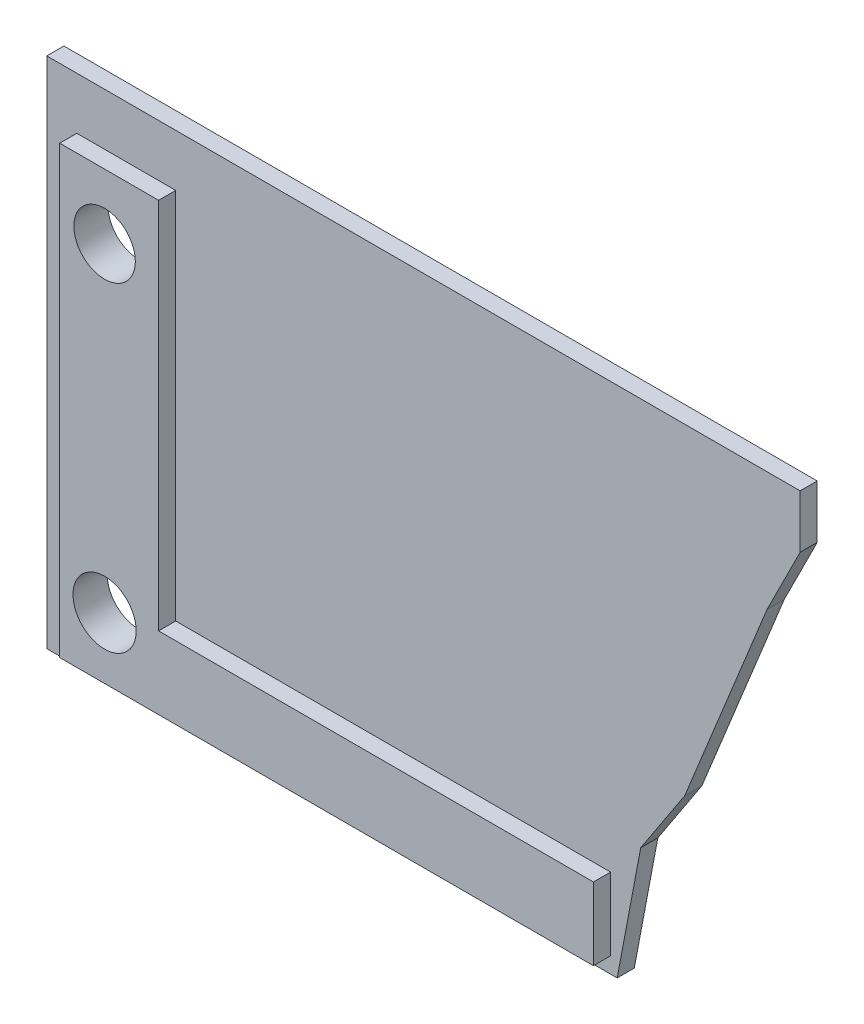
ISO-10303-21;
HEADER;
FILE_DESCRIPTION(('STEP AP214'),'2;1');
FILE_NAME('part.step','',(''),(''),'','','');
FILE_SCHEMA(('AUTOMOTIVE_DESIGN { 1 0 10303 214 1 1 1 1 }'));
ENDSEC;
DATA;
#1=APPLICATION_CONTEXT('core data for automotive mechanical design processes');
#2=APPLICATION_PROTOCOL_DEFINITION('international standard','automotive_design',2000,#1);
#3=PRODUCT_CONTEXT('',#1,'mechanical');
#4=PRODUCT('Part','Part','',(#3));
#5=PRODUCT_RELATED_PRODUCT_CATEGORY('part','',(#4));
#6=PRODUCT_DEFINITION_FORMATION('','',#4);
#7=PRODUCT_DEFINITION_CONTEXT('part definition',#1,'design');
#8=PRODUCT_DEFINITION('design','',#6,#7);
#9=PRODUCT_DEFINITION_SHAPE('','',#8);
#10=(LENGTH_UNIT() NAMED_UNIT(*) SI_UNIT(.MILLI.,.METRE.));
#11=(NAMED_UNIT(*) PLANE_ANGLE_UNIT() SI_UNIT($,.RADIAN.));
#12=(NAMED_UNIT(*) SI_UNIT($,.STERADIAN.) SOLID_ANGLE_UNIT());
#13=UNCERTAINTY_MEASURE_WITH_UNIT(LENGTH_MEASURE(1.E-05),#10,'distance_accuracy_value','');
#14=(GEOMETRIC_REPRESENTATION_CONTEXT(3) GLOBAL_UNCERTAINTY_ASSIGNED_CONTEXT((#13)) GLOBAL_UNIT_ASSIGNED_CONTEXT((#10,
#11,#12)) REPRESENTATION_CONTEXT('',''));
#15=CARTESIAN_POINT('',(0.,0.,0.));
#16=DIRECTION('',(0.,0.,1.));
#17=DIRECTION('',(1.,0.,0.));
#18=AXIS2_PLACEMENT_3D('',#15,#16,#17);
#19=CARTESIAN_POINT('',(0.,0.,6.));
#20=DIRECTION('',(0.,0.,1.));
#21=DIRECTION('',(1.,0.,0.));
#22=AXIS2_PLACEMENT_3D('',#19,#20,#21);
#23=PLANE('',#22);
#24=DIRECTION('',(0.376636486318889,0.92636113755563,0.));
#25=VECTOR('',#24,1.);
#26=CARTESIAN_POINT('',(137.969021905152,-56.0949348202656,6.));
#27=LINE('',#26,#25);
#28=CARTESIAN_POINT('',(168.005565446351,17.7818340371897,6.));
#29=VERTEX_POINT('',#28);
#30=CARTESIAN_POINT('',(196.86553904165,88.7647550782788,6.));
#31=VERTEX_POINT('',#30);
#32=EDGE_CURVE('E194',#29,#31,#27,.T.);
#33=ORIENTED_EDGE('',*,*,#32,.T.);
#34=DIRECTION('',(0.447619623580755,0.894224061734767,0.));
#35=VECTOR('',#34,1.);
#36=CARTESIAN_POINT('',(121.890837423235,-61.0146081950482,6.));
#37=LINE('',#36,#35);
#38=CARTESIAN_POINT('',(208.451032663444,111.909466833332,6.));
#39=VERTEX_POINT('',#38);
#40=EDGE_CURVE('E197',#31,#39,#37,.T.);
#41=ORIENTED_EDGE('',*,*,#40,.T.);
#42=DIRECTION('',(0.,-1.,0.));
#43=VECTOR('',#42,1.);
#44=CARTESIAN_POINT('',(208.451032663444,0.,6.));
#45=LINE('',#44,#43);
#46=CARTESIAN_POINT('',(208.451032663444,130.57113323124,6.));
#47=VERTEX_POINT('',#46);
#48=EDGE_CURVE('E200',#47,#39,#45,.T.);
#49=ORIENTED_EDGE('',*,*,#48,.F.);
#50=DIRECTION('',(1.,0.,0.));
#51=VECTOR('',#50,1.);
#52=CARTESIAN_POINT('',(0.,130.57113323124,6.));
#53=LINE('',#52,#51);
#54=CARTESIAN_POINT('',(-55.6864145286311,130.57113323124,6.));
#55=VERTEX_POINT('',#54);
#56=EDGE_CURVE('E203',#55,#47,#53,.T.);
#57=ORIENTED_EDGE('',*,*,#56,.F.);
#58=DIRECTION('',(0.,-1.,0.));
#59=VECTOR('',#58,1.);
#60=CARTESIAN_POINT('',(-55.6864145286311,0.,6.));
#61=LINE('',#60,#59);
#62=CARTESIAN_POINT('',(-55.6864145286311,-49.4288667687596,6.));
#63=VERTEX_POINT('',#62);
#64=EDGE_CURVE('E206',#55,#63,#61,.T.);
#65=ORIENTED_EDGE('',*,*,#64,.T.);
#66=DIRECTION('',(1.,0.,0.));
#67=VECTOR('',#66,1.);
#68=CARTESIAN_POINT('',(0.,-49.4288667687596,6.));
#69=LINE('',#68,#67);
#70=CARTESIAN_POINT('',(144.313585471369,-49.4288667687596,6.));
#71=VERTEX_POINT('',#70);
#72=EDGE_CURVE('E208',#63,#71,#69,.T.);
#73=ORIENTED_EDGE('',*,*,#72,.T.);
#74=DIRECTION('',(0.185579114608786,0.98262932595207,0.));
#75=VECTOR('',#74,1.);
#76=CARTESIAN_POINT('',(148.3571069308,-28.0186839767509,6.));
#77=LINE('',#76,#75);
#78=CARTESIAN_POINT('',(152.562750690734,-5.75007416184603,6.));
#79=VERTEX_POINT('',#78);
#80=EDGE_CURVE('E210',#71,#79,#77,.T.);
#81=ORIENTED_EDGE('',*,*,#80,.T.);
#82=DIRECTION('',(0.548656441486821,0.836047910837063,0.));
#83=VECTOR('',#82,1.);
#84=CARTESIAN_POINT('',(109.275294569333,-71.7119120611243,6.));
#85=LINE('',#84,#83);
#86=EDGE_CURVE('E212',#79,#29,#85,.T.);
#87=ORIENTED_EDGE('',*,*,#86,.T.);
#88=EDGE_LOOP('',(#33,#41,#49,#57,#65,#73,#81,#87));
#89=FACE_BOUND('',#88,.T.);
#90=DIRECTION('',(0.,1.,0.));
#91=VECTOR('',#90,1.);
#92=CARTESIAN_POINT('',(141.983334497754,-18.4296154829896,6.));
#93=LINE('',#92,#91);
#94=CARTESIAN_POINT('',(141.983334497754,-43.865522875729,6.));
#95=VERTEX_POINT('',#94);
#96=CARTESIAN_POINT('',(141.983334497754,-18.4296154829896,6.));
#97=VERTEX_POINT('',#96);
#98=EDGE_CURVE('E164',#95,#97,#93,.T.);
#99=ORIENTED_EDGE('',*,*,#98,.F.);
#100=DIRECTION('',(1.,0.,0.));
#101=VECTOR('',#100,1.);
#102=CARTESIAN_POINT('',(-45.1468295236403,-43.865522875729,6.));
#103=LINE('',#102,#101);
#104=CARTESIAN_POINT('',(-45.1468295236403,-43.865522875729,6.));
#105=VERTEX_POINT('',#104);
#106=EDGE_CURVE('E50',#105,#95,#103,.T.);
#107=ORIENTED_EDGE('',*,*,#106,.F.);
#108=DIRECTION('',(0.,-1.,0.));
#109=VECTOR('',#108,1.);
#110=CARTESIAN_POINT('',(-45.1468295236403,112.332971202947,6.));
#111=LINE('',#110,#109);
#112=CARTESIAN_POINT('',(-45.1468295236403,112.332971202947,6.));
#113=VERTEX_POINT('',#112);
#114=EDGE_CURVE('E149',#113,#105,#111,.T.);
#115=ORIENTED_EDGE('',*,*,#114,.F.);
#116=DIRECTION('',(1.,0.,0.));
#117=VECTOR('',#116,1.);
#118=CARTESIAN_POINT('',(-45.1468295236403,112.332971202947,6.));
#119=LINE('',#118,#117);
#120=CARTESIAN_POINT('',(-10.4774740360104,112.332971202947,6.));
#121=VERTEX_POINT('',#120);
#122=EDGE_CURVE('E183',#113,#121,#119,.T.);
#123=ORIENTED_EDGE('',*,*,#122,.T.);
#124=DIRECTION('',(0.,-1.,0.));
#125=VECTOR('',#124,1.);
#126=CARTESIAN_POINT('',(-10.4774740360104,112.332971202947,6.));
#127=LINE('',#126,#125);
#128=CARTESIAN_POINT('',(-10.4774740360104,-18.4296154829896,6.));
#129=VERTEX_POINT('',#128);
#130=EDGE_CURVE('E181',#121,#129,#127,.T.);
#131=ORIENTED_EDGE('',*,*,#130,.T.);
#132=DIRECTION('',(-1.,0.,0.));
#133=VECTOR('',#132,1.);
#134=CARTESIAN_POINT('',(-10.4774740360104,-18.4296154829896,6.));
#135=LINE('',#134,#133);
#136=EDGE_CURVE('E57',#97,#129,#135,.T.);
#137=ORIENTED_EDGE('',*,*,#136,.F.);
#138=EDGE_LOOP('',(#99,#107,#115,#123,#131,#137));
#139=FACE_BOUND('',#138,.T.);
#140=ADVANCED_FACE('F35',(#89,#139),#23,.T.);
#141=CARTESIAN_POINT('',(-10.4774740360104,112.332971202947,12.));
#142=DIRECTION('',(1.,0.,0.));
#143=DIRECTION('',(0.,0.,-1.));
#144=AXIS2_PLACEMENT_3D('',#141,#142,#143);
#145=PLANE('',#144);
#146=DIRECTION('',(0.,-1.,0.));
#147=VECTOR('',#146,1.);
#148=CARTESIAN_POINT('',(-10.4774740360104,112.332971202947,12.));
#149=LINE('',#148,#147);
#150=CARTESIAN_POINT('',(-10.4774740360104,112.332971202947,12.));
#151=VERTEX_POINT('',#150);
#152=CARTESIAN_POINT('',(-10.4774740360104,-18.4296154829896,12.));
#153=VERTEX_POINT('',#152);
#154=EDGE_CURVE('E148',#151,#153,#149,.T.);
#155=ORIENTED_EDGE('',*,*,#154,.T.);
#156=DIRECTION('',(0.,0.,-1.));
#157=VECTOR('',#156,1.);
#158=CARTESIAN_POINT('',(-10.4774740360104,-18.4296154829896,12.));
#159=LINE('',#158,#157);
#160=EDGE_CURVE('E162',#153,#129,#159,.T.);
#161=ORIENTED_EDGE('',*,*,#160,.T.);
#162=ORIENTED_EDGE('',*,*,#130,.F.);
#163=DIRECTION('',(0.,0.,-1.));
#164=VECTOR('',#163,1.);
#165=CARTESIAN_POINT('',(-10.4774740360104,112.332971202947,12.));
#166=LINE('',#165,#164);
#167=EDGE_CURVE('E191',#151,#121,#166,.T.);
#168=ORIENTED_EDGE('',*,*,#167,.F.);
#169=EDGE_LOOP('',(#155,#161,#162,#168));
#170=FACE_BOUND('',#169,.T.);
#171=ADVANCED_FACE('F294',(#170),#145,.T.);
#172=CARTESIAN_POINT('',(137.969021905152,-56.0949348202656,6.));
#173=DIRECTION('',(-0.92636113755563,0.376636486318889,0.));
#174=DIRECTION('',(-0.376636486318889,-0.92636113755563,0.));
#175=AXIS2_PLACEMENT_3D('',#172,#173,#174);
#176=PLANE('',#175);
#177=DIRECTION('',(0.376636486318889,0.92636113755563,0.));
#178=VECTOR('',#177,1.);
#179=CARTESIAN_POINT('',(137.969021905152,-56.0949348202656,0.));
#180=LINE('',#179,#178);
#181=CARTESIAN_POINT('',(168.005565446351,17.7818340371897,0.));
#182=VERTEX_POINT('',#181);
#183=CARTESIAN_POINT('',(196.86553904165,88.7647550782788,0.));
#184=VERTEX_POINT('',#183);
#185=EDGE_CURVE('E193',#182,#184,#180,.T.);
#186=ORIENTED_EDGE('',*,*,#185,.T.);
#187=DIRECTION('',(0.,0.,-1.));
#188=VECTOR('',#187,1.);
#189=CARTESIAN_POINT('',(196.86553904165,88.7647550782788,6.));
#190=LINE('',#189,#188);
#191=EDGE_CURVE('E11',#31,#184,#190,.T.);
#192=ORIENTED_EDGE('',*,*,#191,.F.);
#193=ORIENTED_EDGE('',*,*,#32,.F.);
#194=DIRECTION('',(0.,0.,-1.));
#195=VECTOR('',#194,1.);
#196=CARTESIAN_POINT('',(168.005565446351,17.7818340371897,6.));
#197=LINE('',#196,#195);
#198=EDGE_CURVE('E214',#29,#182,#197,.T.);
#199=ORIENTED_EDGE('',*,*,#198,.T.);
#200=EDGE_LOOP('',(#186,#192,#193,#199));
#201=FACE_BOUND('',#200,.T.);
#202=ADVANCED_FACE('F37',(#201),#176,.F.);
#203=CARTESIAN_POINT('',(121.890837423235,-61.0146081950482,6.));
#204=DIRECTION('',(-0.894224061734766,0.447619623580755,0.));
#205=DIRECTION('',(-0.447619623580755,-0.894224061734766,0.));
#206=AXIS2_PLACEMENT_3D('',#203,#204,#205);
#207=PLANE('',#206);
#208=DIRECTION('',(0.447619623580755,0.894224061734767,0.));
#209=VECTOR('',#208,1.);
#210=CARTESIAN_POINT('',(121.890837423235,-61.0146081950482,0.));
#211=LINE('',#210,#209);
#212=CARTESIAN_POINT('',(208.451032663444,111.909466833332,0.));
#213=VERTEX_POINT('',#212);
#214=EDGE_CURVE('E217',#184,#213,#211,.T.);
#215=ORIENTED_EDGE('',*,*,#214,.T.);
#216=DIRECTION('',(0.,0.,-1.));
#217=VECTOR('',#216,1.);
#218=CARTESIAN_POINT('',(208.451032663444,111.909466833332,6.));
#219=LINE('',#218,#217);
#220=EDGE_CURVE('E43',#39,#213,#219,.T.);
#221=ORIENTED_EDGE('',*,*,#220,.F.);
#222=ORIENTED_EDGE('',*,*,#40,.F.);
#223=ORIENTED_EDGE('',*,*,#191,.T.);
#224=EDGE_LOOP('',(#215,#221,#222,#223));
#225=FACE_BOUND('',#224,.T.);
#226=ADVANCED_FACE('F253',(#225),#207,.F.);
#227=CARTESIAN_POINT('',(208.451032663444,0.,6.));
#228=DIRECTION('',(1.,0.,0.));
#229=DIRECTION('',(0.,0.,-1.));
#230=AXIS2_PLACEMENT_3D('',#227,#228,#229);
#231=PLANE('',#230);
#232=DIRECTION('',(0.,-1.,0.));
#233=VECTOR('',#232,1.);
#234=CARTESIAN_POINT('',(208.451032663444,0.,0.));
#235=LINE('',#234,#233);
#236=CARTESIAN_POINT('',(208.451032663444,130.57113323124,0.));
#237=VERTEX_POINT('',#236);
#238=EDGE_CURVE('E220',#237,#213,#235,.T.);
#239=ORIENTED_EDGE('',*,*,#238,.F.);
#240=DIRECTION('',(0.,0.,-1.));
#241=VECTOR('',#240,1.);
#242=CARTESIAN_POINT('',(208.451032663444,130.57113323124,6.));
#243=LINE('',#242,#241);
#244=EDGE_CURVE('E246',#47,#237,#243,.T.);
#245=ORIENTED_EDGE('',*,*,#244,.F.);
#246=ORIENTED_EDGE('',*,*,#48,.T.);
#247=ORIENTED_EDGE('',*,*,#220,.T.);
#248=EDGE_LOOP('',(#239,#245,#246,#247));
#249=FACE_BOUND('',#248,.T.);
#250=ADVANCED_FACE('F250',(#249),#231,.T.);
#251=CARTESIAN_POINT('',(0.,130.57113323124,6.));
#252=DIRECTION('',(0.,1.,0.));
#253=DIRECTION('',(0.,0.,1.));
#254=AXIS2_PLACEMENT_3D('',#251,#252,#253);
#255=PLANE('',#254);
#256=DIRECTION('',(1.,0.,0.));
#257=VECTOR('',#256,1.);
#258=CARTESIAN_POINT('',(0.,130.57113323124,0.));
#259=LINE('',#258,#257);
#260=CARTESIAN_POINT('',(-55.6864145286311,130.57113323124,0.));
#261=VERTEX_POINT('',#260);
#262=EDGE_CURVE('E223',#261,#237,#259,.T.);
#263=ORIENTED_EDGE('',*,*,#262,.F.);
#264=DIRECTION('',(0.,0.,-1.));
#265=VECTOR('',#264,1.);
#266=CARTESIAN_POINT('',(-55.6864145286311,130.57113323124,6.));
#267=LINE('',#266,#265);
#268=EDGE_CURVE('E244',#55,#261,#267,.T.);
#269=ORIENTED_EDGE('',*,*,#268,.F.);
#270=ORIENTED_EDGE('',*,*,#56,.T.);
#271=ORIENTED_EDGE('',*,*,#244,.T.);
#272=EDGE_LOOP('',(#263,#269,#270,#271));
#273=FACE_BOUND('',#272,.T.);
#274=ADVANCED_FACE('F262',(#273),#255,.T.);
#275=CARTESIAN_POINT('',(-55.6864145286311,0.,6.));
#276=DIRECTION('',(1.,0.,0.));
#277=DIRECTION('',(0.,1.,0.));
#278=AXIS2_PLACEMENT_3D('',#275,#276,#277);
#279=PLANE('',#278);
#280=DIRECTION('',(0.,-1.,0.));
#281=VECTOR('',#280,1.);
#282=CARTESIAN_POINT('',(-55.6864145286311,0.,0.));
#283=LINE('',#282,#281);
#284=CARTESIAN_POINT('',(-55.6864145286311,-49.4288667687596,0.));
#285=VERTEX_POINT('',#284);
#286=EDGE_CURVE('E226',#261,#285,#283,.T.);
#287=ORIENTED_EDGE('',*,*,#286,.T.);
#288=DIRECTION('',(0.,0.,-1.));
#289=VECTOR('',#288,1.);
#290=CARTESIAN_POINT('',(-55.6864145286311,-49.4288667687596,6.));
#291=LINE('',#290,#289);
#292=EDGE_CURVE('E241',#63,#285,#291,.T.);
#293=ORIENTED_EDGE('',*,*,#292,.F.);
#294=ORIENTED_EDGE('',*,*,#64,.F.);
#295=ORIENTED_EDGE('',*,*,#268,.T.);
#296=EDGE_LOOP('',(#287,#293,#294,#295));
#297=FACE_BOUND('',#296,.T.);
#298=ADVANCED_FACE('F284',(#297),#279,.F.);
#299=CARTESIAN_POINT('',(0.,-49.4288667687596,6.));
#300=DIRECTION('',(0.,1.,0.));
#301=DIRECTION('',(0.,0.,1.));
#302=AXIS2_PLACEMENT_3D('',#299,#300,#301);
#303=PLANE('',#302);
#304=DIRECTION('',(1.,0.,0.));
#305=VECTOR('',#304,1.);
#306=CARTESIAN_POINT('',(0.,-49.4288667687596,0.));
#307=LINE('',#306,#305);
#308=CARTESIAN_POINT('',(144.313585471369,-49.4288667687596,0.));
#309=VERTEX_POINT('',#308);
#310=EDGE_CURVE('E228',#285,#309,#307,.T.);
#311=ORIENTED_EDGE('',*,*,#310,.T.);
#312=DIRECTION('',(0.,0.,-1.));
#313=VECTOR('',#312,1.);
#314=CARTESIAN_POINT('',(144.313585471369,-49.4288667687596,6.));
#315=LINE('',#314,#313);
#316=EDGE_CURVE('E238',#71,#309,#315,.T.);
#317=ORIENTED_EDGE('',*,*,#316,.F.);
#318=ORIENTED_EDGE('',*,*,#72,.F.);
#319=ORIENTED_EDGE('',*,*,#292,.T.);
#320=EDGE_LOOP('',(#311,#317,#318,#319));
#321=FACE_BOUND('',#320,.T.);
#322=ADVANCED_FACE('F281',(#321),#303,.F.);
#323=CARTESIAN_POINT('',(148.3571069308,-28.0186839767509,6.));
#324=DIRECTION('',(-0.98262932595207,0.185579114608786,0.));
#325=DIRECTION('',(-0.185579114608786,-0.98262932595207,0.));
#326=AXIS2_PLACEMENT_3D('',#323,#324,#325);
#327=PLANE('',#326);
#328=DIRECTION('',(0.185579114608786,0.98262932595207,0.));
#329=VECTOR('',#328,1.);
#330=CARTESIAN_POINT('',(148.3571069308,-28.0186839767509,0.));
#331=LINE('',#330,#329);
#332=CARTESIAN_POINT('',(152.562750690734,-5.75007416184603,0.));
#333=VERTEX_POINT('',#332);
#334=EDGE_CURVE('E230',#309,#333,#331,.T.);
#335=ORIENTED_EDGE('',*,*,#334,.T.);
#336=DIRECTION('',(0.,0.,-1.));
#337=VECTOR('',#336,1.);
#338=CARTESIAN_POINT('',(152.562750690734,-5.75007416184603,6.));
#339=LINE('',#338,#337);
#340=EDGE_CURVE('E235',#79,#333,#339,.T.);
#341=ORIENTED_EDGE('',*,*,#340,.F.);
#342=ORIENTED_EDGE('',*,*,#80,.F.);
#343=ORIENTED_EDGE('',*,*,#316,.T.);
#344=EDGE_LOOP('',(#335,#341,#342,#343));
#345=FACE_BOUND('',#344,.T.);
#346=ADVANCED_FACE('F277',(#345),#327,.F.);
#347=CARTESIAN_POINT('',(109.275294569333,-71.7119120611243,6.));
#348=DIRECTION('',(-0.836047910837063,0.548656441486821,0.));
#349=DIRECTION('',(-0.548656441486821,-0.836047910837063,0.));
#350=AXIS2_PLACEMENT_3D('',#347,#348,#349);
#351=PLANE('',#350);
#352=DIRECTION('',(0.548656441486821,0.836047910837063,0.));
#353=VECTOR('',#352,1.);
#354=CARTESIAN_POINT('',(109.275294569333,-71.7119120611243,0.));
#355=LINE('',#354,#353);
#356=EDGE_CURVE('E198',#333,#182,#355,.T.);
#357=ORIENTED_EDGE('',*,*,#356,.T.);
#358=ORIENTED_EDGE('',*,*,#198,.F.);
#359=ORIENTED_EDGE('',*,*,#86,.F.);
#360=ORIENTED_EDGE('',*,*,#340,.T.);
#361=EDGE_LOOP('',(#357,#358,#359,#360));
#362=FACE_BOUND('',#361,.T.);
#363=ADVANCED_FACE('F273',(#362),#351,.F.);
#364=CARTESIAN_POINT('',(0.,0.,0.));
#365=DIRECTION('',(0.,0.,1.));
#366=DIRECTION('',(1.,0.,0.));
#367=AXIS2_PLACEMENT_3D('',#364,#365,#366);
#368=PLANE('',#367);
#369=CARTESIAN_POINT('',(-29.4117105950136,89.6577965370824,0.));
#370=DIRECTION('',(0.,0.,1.));
#371=DIRECTION('',(1.,0.,0.));
#372=AXIS2_PLACEMENT_3D('',#369,#370,#371);
#373=CIRCLE('',#372,10.7752419968313);
#374=CARTESIAN_POINT('',(-18.6364685981823,89.6577965370824,0.));
#375=VERTEX_POINT('',#374);
#376=EDGE_CURVE('E464',#375,#375,#373,.T.);
#377=ORIENTED_EDGE('',*,*,#376,.T.);
#378=EDGE_LOOP('',(#377));
#379=FACE_BOUND('',#378,.T.);
#380=CARTESIAN_POINT('',(-29.4117105950136,-22.3645681057434,0.));
#381=DIRECTION('',(0.,0.,1.));
#382=DIRECTION('',(1.,0.,0.));
#383=AXIS2_PLACEMENT_3D('',#380,#381,#382);
#384=CIRCLE('',#383,11.0764866211129);
#385=CARTESIAN_POINT('',(-18.3352239739007,-22.3645681057434,0.));
#386=VERTEX_POINT('',#385);
#387=EDGE_CURVE('E170',#386,#386,#384,.T.);
#388=ORIENTED_EDGE('',*,*,#387,.T.);
#389=EDGE_LOOP('',(#388));
#390=FACE_BOUND('',#389,.T.);
#391=ORIENTED_EDGE('',*,*,#185,.F.);
#392=ORIENTED_EDGE('',*,*,#356,.F.);
#393=ORIENTED_EDGE('',*,*,#334,.F.);
#394=ORIENTED_EDGE('',*,*,#310,.F.);
#395=ORIENTED_EDGE('',*,*,#286,.F.);
#396=ORIENTED_EDGE('',*,*,#262,.T.);
#397=ORIENTED_EDGE('',*,*,#238,.T.);
#398=ORIENTED_EDGE('',*,*,#214,.F.);
#399=EDGE_LOOP('',(#391,#392,#393,#394,#395,#396,#397,#398));
#400=FACE_BOUND('',#399,.T.);
#401=ADVANCED_FACE('F257',(#379,#390,#400),#368,.F.);
#402=CARTESIAN_POINT('',(-45.1468295236403,-43.865522875729,12.));
#403=DIRECTION('',(0.,1.,0.));
#404=DIRECTION('',(0.,0.,1.));
#405=AXIS2_PLACEMENT_3D('',#402,#403,#404);
#406=PLANE('',#405);
#407=ORIENTED_EDGE('',*,*,#106,.T.);
#408=DIRECTION('',(0.,0.,-1.));
#409=VECTOR('',#408,1.);
#410=CARTESIAN_POINT('',(141.983334497754,-43.865522875729,12.));
#411=LINE('',#410,#409);
#412=CARTESIAN_POINT('',(141.983334497754,-43.865522875729,12.));
#413=VERTEX_POINT('',#412);
#414=EDGE_CURVE('E152',#413,#95,#411,.T.);
#415=ORIENTED_EDGE('',*,*,#414,.F.);
#416=DIRECTION('',(1.,0.,0.));
#417=VECTOR('',#416,1.);
#418=CARTESIAN_POINT('',(-45.1468295236403,-43.865522875729,12.));
#419=LINE('',#418,#417);
#420=CARTESIAN_POINT('',(-45.1468295236403,-43.865522875729,12.));
#421=VERTEX_POINT('',#420);
#422=EDGE_CURVE('E138',#421,#413,#419,.T.);
#423=ORIENTED_EDGE('',*,*,#422,.F.);
#424=DIRECTION('',(0.,0.,-1.));
#425=VECTOR('',#424,1.);
#426=CARTESIAN_POINT('',(-45.1468295236403,-43.865522875729,12.));
#427=LINE('',#426,#425);
#428=EDGE_CURVE('E179',#421,#105,#427,.T.);
#429=ORIENTED_EDGE('',*,*,#428,.T.);
#430=EDGE_LOOP('',(#407,#415,#423,#429));
#431=FACE_BOUND('',#430,.T.);
#432=ADVANCED_FACE('F153',(#431),#406,.F.);
#433=CARTESIAN_POINT('',(-45.1468295236403,112.332971202947,12.));
#434=DIRECTION('',(0.,1.,0.));
#435=DIRECTION('',(0.,0.,1.));
#436=AXIS2_PLACEMENT_3D('',#433,#434,#435);
#437=PLANE('',#436);
#438=ORIENTED_EDGE('',*,*,#122,.F.);
#439=DIRECTION('',(0.,0.,-1.));
#440=VECTOR('',#439,1.);
#441=CARTESIAN_POINT('',(-45.1468295236403,112.332971202947,12.));
#442=LINE('',#441,#440);
#443=CARTESIAN_POINT('',(-45.1468295236403,112.332971202947,12.));
#444=VERTEX_POINT('',#443);
#445=EDGE_CURVE('E188',#444,#113,#442,.T.);
#446=ORIENTED_EDGE('',*,*,#445,.F.);
#447=DIRECTION('',(1.,0.,0.));
#448=VECTOR('',#447,1.);
#449=CARTESIAN_POINT('',(-45.1468295236403,112.332971202947,12.));
#450=LINE('',#449,#448);
#451=EDGE_CURVE('E175',#444,#151,#450,.T.);
#452=ORIENTED_EDGE('',*,*,#451,.T.);
#453=ORIENTED_EDGE('',*,*,#167,.T.);
#454=EDGE_LOOP('',(#438,#446,#452,#453));
#455=FACE_BOUND('',#454,.T.);
#456=ADVANCED_FACE('F330',(#455),#437,.T.);
#457=CARTESIAN_POINT('',(-45.1468295236403,112.332971202947,12.));
#458=DIRECTION('',(1.,0.,0.));
#459=DIRECTION('',(0.,0.,-1.));
#460=AXIS2_PLACEMENT_3D('',#457,#458,#459);
#461=PLANE('',#460);
#462=ORIENTED_EDGE('',*,*,#114,.T.);
#463=ORIENTED_EDGE('',*,*,#428,.F.);
#464=DIRECTION('',(0.,-1.,0.));
#465=VECTOR('',#464,1.);
#466=CARTESIAN_POINT('',(-45.1468295236403,112.332971202947,12.));
#467=LINE('',#466,#465);
#468=EDGE_CURVE('E146',#444,#421,#467,.T.);
#469=ORIENTED_EDGE('',*,*,#468,.F.);
#470=ORIENTED_EDGE('',*,*,#445,.T.);
#471=EDGE_LOOP('',(#462,#463,#469,#470));
#472=FACE_BOUND('',#471,.T.);
#473=ADVANCED_FACE('F337',(#472),#461,.F.);
#474=CARTESIAN_POINT('',(0.,0.,12.));
#475=DIRECTION('',(0.,0.,-1.));
#476=DIRECTION('',(-1.,0.,0.));
#477=AXIS2_PLACEMENT_3D('',#474,#475,#476);
#478=PLANE('',#477);
#479=CARTESIAN_POINT('',(-29.4117105950136,89.6577965370824,12.));
#480=DIRECTION('',(0.,0.,1.));
#481=DIRECTION('',(1.,0.,0.));
#482=AXIS2_PLACEMENT_3D('',#479,#480,#481);
#483=CIRCLE('',#482,10.7752419968313);
#484=CARTESIAN_POINT('',(-18.6364685981823,89.6577965370824,12.));
#485=VERTEX_POINT('',#484);
#486=EDGE_CURVE('E467',#485,#485,#483,.T.);
#487=ORIENTED_EDGE('',*,*,#486,.F.);
#488=EDGE_LOOP('',(#487));
#489=FACE_BOUND('',#488,.T.);
#490=CARTESIAN_POINT('',(-29.4117105950136,-22.3645681057434,12.));
#491=DIRECTION('',(0.,0.,1.));
#492=DIRECTION('',(1.,0.,0.));
#493=AXIS2_PLACEMENT_3D('',#490,#491,#492);
#494=CIRCLE('',#493,11.0764866211129);
#495=CARTESIAN_POINT('',(-18.3352239739007,-22.3645681057434,12.));
#496=VERTEX_POINT('',#495);
#497=EDGE_CURVE('E167',#496,#496,#494,.T.);
#498=ORIENTED_EDGE('',*,*,#497,.F.);
#499=EDGE_LOOP('',(#498));
#500=FACE_BOUND('',#499,.T.);
#501=ORIENTED_EDGE('',*,*,#422,.T.);
#502=DIRECTION('',(0.,1.,0.));
#503=VECTOR('',#502,1.);
#504=CARTESIAN_POINT('',(141.983334497754,-18.4296154829896,12.));
#505=LINE('',#504,#503);
#506=CARTESIAN_POINT('',(141.983334497754,-18.4296154829896,12.));
#507=VERTEX_POINT('',#506);
#508=EDGE_CURVE('E142',#413,#507,#505,.T.);
#509=ORIENTED_EDGE('',*,*,#508,.T.);
#510=DIRECTION('',(-1.,0.,0.));
#511=VECTOR('',#510,1.);
#512=CARTESIAN_POINT('',(-10.4774740360104,-18.4296154829896,12.));
#513=LINE('',#512,#511);
#514=EDGE_CURVE('E160',#507,#153,#513,.T.);
#515=ORIENTED_EDGE('',*,*,#514,.T.);
#516=ORIENTED_EDGE('',*,*,#154,.F.);
#517=ORIENTED_EDGE('',*,*,#451,.F.);
#518=ORIENTED_EDGE('',*,*,#468,.T.);
#519=EDGE_LOOP('',(#501,#509,#515,#516,#517,#518));
#520=FACE_BOUND('',#519,.T.);
#521=ADVANCED_FACE('F139',(#489,#500,#520),#478,.F.);
#522=CARTESIAN_POINT('',(141.983334497754,-18.4296154829896,12.));
#523=DIRECTION('',(-1.,0.,0.));
#524=DIRECTION('',(0.,0.,1.));
#525=AXIS2_PLACEMENT_3D('',#522,#523,#524);
#526=PLANE('',#525);
#527=ORIENTED_EDGE('',*,*,#98,.T.);
#528=DIRECTION('',(0.,0.,-1.));
#529=VECTOR('',#528,1.);
#530=CARTESIAN_POINT('',(141.983334497754,-18.4296154829896,12.));
#531=LINE('',#530,#529);
#532=EDGE_CURVE('E155',#507,#97,#531,.T.);
#533=ORIENTED_EDGE('',*,*,#532,.F.);
#534=ORIENTED_EDGE('',*,*,#508,.F.);
#535=ORIENTED_EDGE('',*,*,#414,.T.);
#536=EDGE_LOOP('',(#527,#533,#534,#535));
#537=FACE_BOUND('',#536,.T.);
#538=ADVANCED_FACE('F157',(#537),#526,.F.);
#539=CARTESIAN_POINT('',(-10.4774740360104,-18.4296154829896,12.));
#540=DIRECTION('',(0.,-1.,0.));
#541=DIRECTION('',(0.,0.,-1.));
#542=AXIS2_PLACEMENT_3D('',#539,#540,#541);
#543=PLANE('',#542);
#544=ORIENTED_EDGE('',*,*,#136,.T.);
#545=ORIENTED_EDGE('',*,*,#160,.F.);
#546=ORIENTED_EDGE('',*,*,#514,.F.);
#547=ORIENTED_EDGE('',*,*,#532,.T.);
#548=EDGE_LOOP('',(#544,#545,#546,#547));
#549=FACE_BOUND('',#548,.T.);
#550=ADVANCED_FACE('F358',(#549),#543,.F.);
#551=CARTESIAN_POINT('',(-29.4117105950136,-22.3645681057434,0.));
#552=DIRECTION('',(0.,0.,1.));
#553=DIRECTION('',(1.,0.,0.));
#554=AXIS2_PLACEMENT_3D('',#551,#552,#553);
#555=CYLINDRICAL_SURFACE('',#554,11.0764866211129);
#556=ORIENTED_EDGE('',*,*,#387,.F.);
#557=EDGE_LOOP('',(#556));
#558=FACE_BOUND('',#557,.T.);
#559=ORIENTED_EDGE('',*,*,#497,.T.);
#560=EDGE_LOOP('',(#559));
#561=FACE_BOUND('',#560,.T.);
#562=ADVANCED_FACE('F364',(#558,#561),#555,.F.);
#563=CARTESIAN_POINT('',(-29.4117105950136,89.6577965370824,0.));
#564=DIRECTION('',(0.,0.,1.));
#565=DIRECTION('',(1.,0.,0.));
#566=AXIS2_PLACEMENT_3D('',#563,#564,#565);
#567=CYLINDRICAL_SURFACE('',#566,10.7752419968313);
#568=ORIENTED_EDGE('',*,*,#376,.F.);
#569=EDGE_LOOP('',(#568));
#570=FACE_BOUND('',#569,.T.);
#571=ORIENTED_EDGE('',*,*,#486,.T.);
#572=EDGE_LOOP('',(#571));
#573=FACE_BOUND('',#572,.T.);
#574=ADVANCED_FACE('F371',(#570,#573),#567,.F.);
#575=CLOSED_SHELL('',(#140,#171,#202,#226,#250,#274,#298,#322,#346,#363,#401,#432,#456,#473,
#521,#538,#550,#562,#574));
#576=MANIFOLD_SOLID_BREP('B2',#575);
#577=ADVANCED_BREP_SHAPE_REPRESENTATION('',(#18,#576),#14);
#578=SHAPE_DEFINITION_REPRESENTATION(#9,#577);
ENDSEC;
END-ISO-10303-21;
